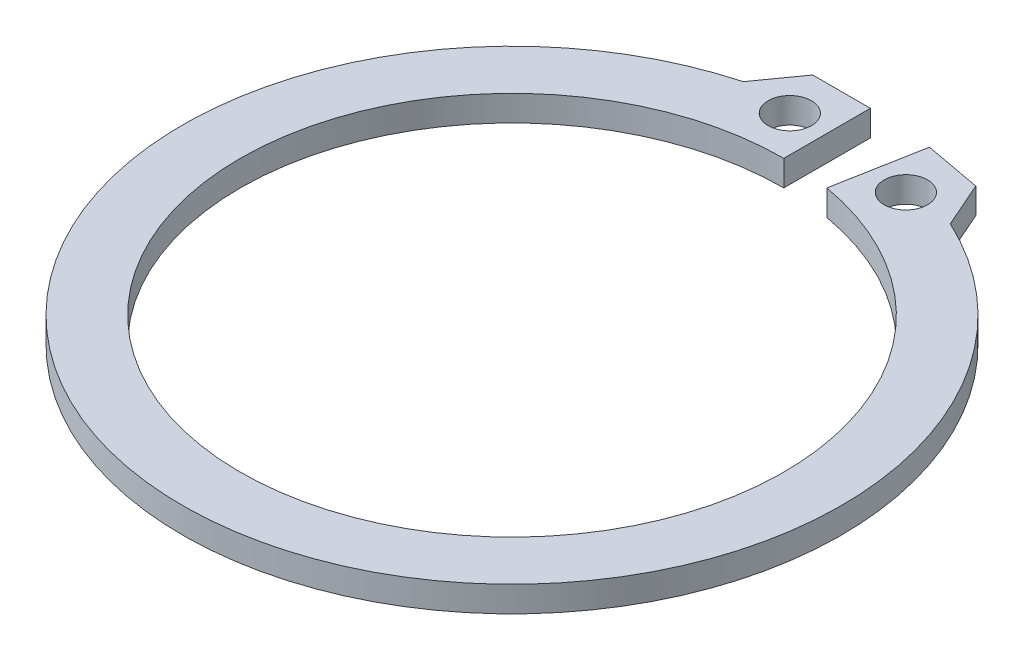
ISO-10303-21;
HEADER;
FILE_DESCRIPTION(('STEP AP214'),'2;1');
FILE_NAME('part.step','',(''),(''),'','','');
FILE_SCHEMA(('AUTOMOTIVE_DESIGN { 1 0 10303 214 1 1 1 1 }'));
ENDSEC;
DATA;
#1=APPLICATION_CONTEXT('core data for automotive mechanical design processes');
#2=APPLICATION_PROTOCOL_DEFINITION('international standard','automotive_design',2000,#1);
#3=PRODUCT_CONTEXT('',#1,'mechanical');
#4=PRODUCT('Part','Part','',(#3));
#5=PRODUCT_RELATED_PRODUCT_CATEGORY('part','',(#4));
#6=PRODUCT_DEFINITION_FORMATION('','',#4);
#7=PRODUCT_DEFINITION_CONTEXT('part definition',#1,'design');
#8=PRODUCT_DEFINITION('design','',#6,#7);
#9=PRODUCT_DEFINITION_SHAPE('','',#8);
#10=(LENGTH_UNIT() NAMED_UNIT(*) SI_UNIT(.MILLI.,.METRE.));
#11=(NAMED_UNIT(*) PLANE_ANGLE_UNIT() SI_UNIT($,.RADIAN.));
#12=(NAMED_UNIT(*) SI_UNIT($,.STERADIAN.) SOLID_ANGLE_UNIT());
#13=UNCERTAINTY_MEASURE_WITH_UNIT(LENGTH_MEASURE(1.E-05),#10,'distance_accuracy_value','');
#14=(GEOMETRIC_REPRESENTATION_CONTEXT(3) GLOBAL_UNCERTAINTY_ASSIGNED_CONTEXT((#13)) GLOBAL_UNIT_ASSIGNED_CONTEXT((#10,
#11,#12)) REPRESENTATION_CONTEXT('',''));
#15=CARTESIAN_POINT('',(0.,0.,0.));
#16=DIRECTION('',(0.,0.,1.));
#17=DIRECTION('',(1.,0.,0.));
#18=AXIS2_PLACEMENT_3D('',#15,#16,#17);
#19=CARTESIAN_POINT('',(0.,0.889,0.));
#20=DIRECTION('',(0.,-1.,0.));
#21=DIRECTION('',(0.,0.,-1.));
#22=AXIS2_PLACEMENT_3D('',#19,#20,#21);
#23=CYLINDRICAL_SURFACE('',#22,9.41448468511322);
#24=CARTESIAN_POINT('',(0.,0.,0.));
#25=DIRECTION('',(0.,-1.,0.));
#26=DIRECTION('',(0.,0.,-1.));
#27=AXIS2_PLACEMENT_3D('',#24,#25,#26);
#28=CIRCLE('',#27,9.41448468511322);
#29=CARTESIAN_POINT('',(1.63480810924314,0.,-9.27145750851419));
#30=VERTEX_POINT('',#29);
#31=CARTESIAN_POINT('',(0.,0.,-9.41448468511322));
#32=VERTEX_POINT('',#31);
#33=EDGE_CURVE('E129',#30,#32,#28,.T.);
#34=ORIENTED_EDGE('',*,*,#33,.T.);
#35=DIRECTION('',(0.,-1.,0.));
#36=VECTOR('',#35,1.);
#37=CARTESIAN_POINT('',(0.,0.889,-9.41448468511322));
#38=LINE('',#37,#36);
#39=CARTESIAN_POINT('',(0.,0.889,-9.41448468511322));
#40=VERTEX_POINT('',#39);
#41=EDGE_CURVE('E11',#40,#32,#38,.T.);
#42=ORIENTED_EDGE('',*,*,#41,.F.);
#43=CARTESIAN_POINT('',(0.,0.889,0.));
#44=DIRECTION('',(0.,-1.,0.));
#45=DIRECTION('',(0.,0.,-1.));
#46=AXIS2_PLACEMENT_3D('',#43,#44,#45);
#47=CIRCLE('',#46,9.41448468511322);
#48=CARTESIAN_POINT('',(1.63480810924314,0.889,-9.27145750851419));
#49=VERTEX_POINT('',#48);
#50=EDGE_CURVE('E144',#49,#40,#47,.T.);
#51=ORIENTED_EDGE('',*,*,#50,.F.);
#52=DIRECTION('',(0.,-1.,0.));
#53=VECTOR('',#52,1.);
#54=CARTESIAN_POINT('',(1.63480810924314,0.889,-9.27145750851419));
#55=LINE('',#54,#53);
#56=EDGE_CURVE('E125',#49,#30,#55,.T.);
#57=ORIENTED_EDGE('',*,*,#56,.T.);
#58=EDGE_LOOP('',(#34,#42,#51,#57));
#59=FACE_BOUND('',#58,.T.);
#60=ADVANCED_FACE('F33',(#59),#23,.F.);
#61=CARTESIAN_POINT('',(0.,0.889,-12.4144846851132));
#62=DIRECTION('',(-1.,0.,0.));
#63=DIRECTION('',(0.,0.,1.));
#64=AXIS2_PLACEMENT_3D('',#61,#62,#63);
#65=PLANE('',#64);
#66=DIRECTION('',(0.,0.,-1.));
#67=VECTOR('',#66,1.);
#68=CARTESIAN_POINT('',(0.,0.,-12.4144846851132));
#69=LINE('',#68,#67);
#70=CARTESIAN_POINT('',(0.,0.,-12.4144846851132));
#71=VERTEX_POINT('',#70);
#72=EDGE_CURVE('E132',#32,#71,#69,.T.);
#73=ORIENTED_EDGE('',*,*,#72,.T.);
#74=DIRECTION('',(0.,-1.,0.));
#75=VECTOR('',#74,1.);
#76=CARTESIAN_POINT('',(0.,0.889,-12.4144846851132));
#77=LINE('',#76,#75);
#78=CARTESIAN_POINT('',(0.,0.889,-12.4144846851132));
#79=VERTEX_POINT('',#78);
#80=EDGE_CURVE('E41',#79,#71,#77,.T.);
#81=ORIENTED_EDGE('',*,*,#80,.F.);
#82=DIRECTION('',(0.,0.,-1.));
#83=VECTOR('',#82,1.);
#84=CARTESIAN_POINT('',(0.,0.889,-12.4144846851132));
#85=LINE('',#84,#83);
#86=EDGE_CURVE('E92',#40,#79,#85,.T.);
#87=ORIENTED_EDGE('',*,*,#86,.F.);
#88=ORIENTED_EDGE('',*,*,#41,.T.);
#89=EDGE_LOOP('',(#73,#81,#87,#88));
#90=FACE_BOUND('',#89,.T.);
#91=ADVANCED_FACE('F213',(#90),#65,.F.);
#92=CARTESIAN_POINT('',(0.,0.889,-12.4144846851132));
#93=DIRECTION('',(0.,0.,1.));
#94=DIRECTION('',(1.,0.,0.));
#95=AXIS2_PLACEMENT_3D('',#92,#93,#94);
#96=PLANE('',#95);
#97=DIRECTION('',(-1.,0.,0.));
#98=VECTOR('',#97,1.);
#99=CARTESIAN_POINT('',(0.,0.,-12.4144846851132));
#100=LINE('',#99,#98);
#101=CARTESIAN_POINT('',(-2.,0.,-12.4144846851132));
#102=VERTEX_POINT('',#101);
#103=EDGE_CURVE('E135',#71,#102,#100,.T.);
#104=ORIENTED_EDGE('',*,*,#103,.T.);
#105=DIRECTION('',(0.,-1.,0.));
#106=VECTOR('',#105,1.);
#107=CARTESIAN_POINT('',(-2.,0.889,-12.4144846851132));
#108=LINE('',#107,#106);
#109=CARTESIAN_POINT('',(-2.,0.889,-12.4144846851132));
#110=VERTEX_POINT('',#109);
#111=EDGE_CURVE('E151',#110,#102,#108,.T.);
#112=ORIENTED_EDGE('',*,*,#111,.F.);
#113=DIRECTION('',(-1.,0.,0.));
#114=VECTOR('',#113,1.);
#115=CARTESIAN_POINT('',(0.,0.889,-12.4144846851132));
#116=LINE('',#115,#114);
#117=EDGE_CURVE('E159',#79,#110,#116,.T.);
#118=ORIENTED_EDGE('',*,*,#117,.F.);
#119=ORIENTED_EDGE('',*,*,#80,.T.);
#120=EDGE_LOOP('',(#104,#112,#118,#119));
#121=FACE_BOUND('',#120,.T.);
#122=ADVANCED_FACE('F157',(#121),#96,.F.);
#123=CARTESIAN_POINT('',(-2.,0.889,-12.4144846851132));
#124=DIRECTION('',(0.813986518689563,0.,0.580883764097126));
#125=DIRECTION('',(0.580883764097126,0.,-0.813986518689563));
#126=AXIS2_PLACEMENT_3D('',#123,#124,#125);
#127=PLANE('',#126);
#128=DIRECTION('',(-0.580883764097126,0.,0.813986518689563));
#129=VECTOR('',#128,1.);
#130=CARTESIAN_POINT('',(-2.,0.,-12.4144846851132));
#131=LINE('',#130,#129);
#132=CARTESIAN_POINT('',(-3.,0.,-11.0131948419468));
#133=VERTEX_POINT('',#132);
#134=EDGE_CURVE('E137',#102,#133,#131,.T.);
#135=ORIENTED_EDGE('',*,*,#134,.T.);
#136=DIRECTION('',(0.,-1.,0.));
#137=VECTOR('',#136,1.);
#138=CARTESIAN_POINT('',(-3.,0.889,-11.0131948419468));
#139=LINE('',#138,#137);
#140=CARTESIAN_POINT('',(-3.,0.889,-11.0131948419468));
#141=VERTEX_POINT('',#140);
#142=EDGE_CURVE('E148',#141,#133,#139,.T.);
#143=ORIENTED_EDGE('',*,*,#142,.F.);
#144=DIRECTION('',(-0.580883764097126,0.,0.813986518689563));
#145=VECTOR('',#144,1.);
#146=CARTESIAN_POINT('',(-2.,0.889,-12.4144846851132));
#147=LINE('',#146,#145);
#148=EDGE_CURVE('E171',#110,#141,#147,.T.);
#149=ORIENTED_EDGE('',*,*,#148,.F.);
#150=ORIENTED_EDGE('',*,*,#111,.T.);
#151=EDGE_LOOP('',(#135,#143,#149,#150));
#152=FACE_BOUND('',#151,.T.);
#153=ADVANCED_FACE('F167',(#152),#127,.F.);
#154=CARTESIAN_POINT('',(0.,0.889,0.));
#155=DIRECTION('',(0.,-1.,0.));
#156=DIRECTION('',(0.,0.,-1.));
#157=AXIS2_PLACEMENT_3D('',#154,#155,#156);
#158=CYLINDRICAL_SURFACE('',#157,11.4144846851132);
#159=CARTESIAN_POINT('',(0.,0.,0.));
#160=DIRECTION('',(0.,1.,0.));
#161=DIRECTION('',(0.,0.,-1.));
#162=AXIS2_PLACEMENT_3D('',#159,#160,#161);
#163=CIRCLE('',#162,11.4144846851132);
#164=CARTESIAN_POINT('',(4.84891471824417,0.,-10.3333676350878));
#165=VERTEX_POINT('',#164);
#166=EDGE_CURVE('E139',#133,#165,#163,.T.);
#167=ORIENTED_EDGE('',*,*,#166,.T.);
#168=DIRECTION('',(0.,-1.,0.));
#169=VECTOR('',#168,1.);
#170=CARTESIAN_POINT('',(4.84891471824417,0.889,-10.3333676350878));
#171=LINE('',#170,#169);
#172=CARTESIAN_POINT('',(4.84891471824417,0.889,-10.3333676350878));
#173=VERTEX_POINT('',#172);
#174=EDGE_CURVE('E120',#173,#165,#171,.T.);
#175=ORIENTED_EDGE('',*,*,#174,.F.);
#176=CARTESIAN_POINT('',(0.,0.889,0.));
#177=DIRECTION('',(0.,1.,0.));
#178=DIRECTION('',(0.,0.,-1.));
#179=AXIS2_PLACEMENT_3D('',#176,#177,#178);
#180=CIRCLE('',#179,11.4144846851132);
#181=EDGE_CURVE('E111',#141,#173,#180,.T.);
#182=ORIENTED_EDGE('',*,*,#181,.F.);
#183=ORIENTED_EDGE('',*,*,#142,.T.);
#184=EDGE_LOOP('',(#167,#175,#182,#183));
#185=FACE_BOUND('',#184,.T.);
#186=ADVANCED_FACE('F170',(#185),#158,.T.);
#187=CARTESIAN_POINT('',(4.15573147773122,0.889,-11.9081379130976));
#188=DIRECTION('',(-0.915254107129877,0.,0.402877052438943));
#189=DIRECTION('',(0.402877052438943,0.,0.915254107129877));
#190=AXIS2_PLACEMENT_3D('',#187,#188,#189);
#191=PLANE('',#190);
#192=DIRECTION('',(-0.402877052438943,0.,-0.915254107129877));
#193=VECTOR('',#192,1.);
#194=CARTESIAN_POINT('',(4.15573147773122,0.,-11.9081379130976));
#195=LINE('',#194,#193);
#196=CARTESIAN_POINT('',(4.15573147773122,0.,-11.9081379130976));
#197=VERTEX_POINT('',#196);
#198=EDGE_CURVE('E119',#165,#197,#195,.T.);
#199=ORIENTED_EDGE('',*,*,#198,.T.);
#200=DIRECTION('',(0.,-1.,0.));
#201=VECTOR('',#200,1.);
#202=CARTESIAN_POINT('',(4.15573147773122,0.889,-11.9081379130976));
#203=LINE('',#202,#201);
#204=CARTESIAN_POINT('',(4.15573147773122,0.889,-11.9081379130976));
#205=VERTEX_POINT('',#204);
#206=EDGE_CURVE('E116',#205,#197,#203,.T.);
#207=ORIENTED_EDGE('',*,*,#206,.F.);
#208=DIRECTION('',(-0.402877052438943,0.,-0.915254107129877));
#209=VECTOR('',#208,1.);
#210=CARTESIAN_POINT('',(4.15573147773122,0.889,-11.9081379130976));
#211=LINE('',#210,#209);
#212=EDGE_CURVE('E105',#173,#205,#211,.T.);
#213=ORIENTED_EDGE('',*,*,#212,.F.);
#214=ORIENTED_EDGE('',*,*,#174,.T.);
#215=EDGE_LOOP('',(#199,#207,#213,#214));
#216=FACE_BOUND('',#215,.T.);
#217=ADVANCED_FACE('F117',(#216),#191,.F.);
#218=CARTESIAN_POINT('',(2.18900860157751,0.889,-12.2714575085142));
#219=DIRECTION('',(-0.181659797708278,0.,0.983361438076859));
#220=DIRECTION('',(0.983361438076859,0.,0.181659797708278));
#221=AXIS2_PLACEMENT_3D('',#218,#219,#220);
#222=PLANE('',#221);
#223=DIRECTION('',(-0.983361438076859,0.,-0.181659797708278));
#224=VECTOR('',#223,1.);
#225=CARTESIAN_POINT('',(2.18900860157751,0.,-12.2714575085142));
#226=LINE('',#225,#224);
#227=CARTESIAN_POINT('',(2.18900860157751,0.,-12.2714575085142));
#228=VERTEX_POINT('',#227);
#229=EDGE_CURVE('E78',#197,#228,#226,.T.);
#230=ORIENTED_EDGE('',*,*,#229,.T.);
#231=DIRECTION('',(0.,-1.,0.));
#232=VECTOR('',#231,1.);
#233=CARTESIAN_POINT('',(2.18900860157751,0.889,-12.2714575085142));
#234=LINE('',#233,#232);
#235=CARTESIAN_POINT('',(2.18900860157751,0.889,-12.2714575085142));
#236=VERTEX_POINT('',#235);
#237=EDGE_CURVE('E121',#236,#228,#234,.T.);
#238=ORIENTED_EDGE('',*,*,#237,.F.);
#239=DIRECTION('',(-0.983361438076859,0.,-0.181659797708278));
#240=VECTOR('',#239,1.);
#241=CARTESIAN_POINT('',(2.18900860157751,0.889,-12.2714575085142));
#242=LINE('',#241,#240);
#243=EDGE_CURVE('E109',#205,#236,#242,.T.);
#244=ORIENTED_EDGE('',*,*,#243,.F.);
#245=ORIENTED_EDGE('',*,*,#206,.T.);
#246=EDGE_LOOP('',(#230,#238,#244,#245));
#247=FACE_BOUND('',#246,.T.);
#248=ADVANCED_FACE('F123',(#247),#222,.F.);
#249=CARTESIAN_POINT('',(1.63480810924314,0.889,-9.27145750851419));
#250=DIRECTION('',(0.983361438076859,0.,0.181659797708274));
#251=DIRECTION('',(0.181659797708274,0.,-0.983361438076859));
#252=AXIS2_PLACEMENT_3D('',#249,#250,#251);
#253=PLANE('',#252);
#254=DIRECTION('',(-0.181659797708274,0.,0.98336143807686));
#255=VECTOR('',#254,1.);
#256=CARTESIAN_POINT('',(1.63480810924314,0.,-9.27145750851419));
#257=LINE('',#256,#255);
#258=EDGE_CURVE('E84',#228,#30,#257,.T.);
#259=ORIENTED_EDGE('',*,*,#258,.T.);
#260=ORIENTED_EDGE('',*,*,#56,.F.);
#261=DIRECTION('',(-0.181659797708274,0.,0.98336143807686));
#262=VECTOR('',#261,1.);
#263=CARTESIAN_POINT('',(1.63480810924314,0.889,-9.27145750851419));
#264=LINE('',#263,#262);
#265=EDGE_CURVE('E49',#236,#49,#264,.T.);
#266=ORIENTED_EDGE('',*,*,#265,.F.);
#267=ORIENTED_EDGE('',*,*,#237,.T.);
#268=EDGE_LOOP('',(#259,#260,#266,#267));
#269=FACE_BOUND('',#268,.T.);
#270=ADVANCED_FACE('F200',(#269),#253,.F.);
#271=CARTESIAN_POINT('',(0.,0.889,0.));
#272=DIRECTION('',(0.,-1.,0.));
#273=DIRECTION('',(0.,0.,-1.));
#274=AXIS2_PLACEMENT_3D('',#271,#272,#273);
#275=PLANE('',#274);
#276=CARTESIAN_POINT('',(3.13447106131304,0.889,-10.5084440075243));
#277=DIRECTION('',(0.,1.,0.));
#278=DIRECTION('',(0.,0.,1.));
#279=AXIS2_PLACEMENT_3D('',#276,#277,#278);
#280=CIRCLE('',#279,0.75);
#281=CARTESIAN_POINT('',(3.13447106131304,0.889,-9.75844400752434));
#282=VERTEX_POINT('',#281);
#283=EDGE_CURVE('E183',#282,#282,#280,.T.);
#284=ORIENTED_EDGE('',*,*,#283,.F.);
#285=EDGE_LOOP('',(#284));
#286=FACE_BOUND('',#285,.T.);
#287=CARTESIAN_POINT('',(-1.25,0.889,-10.8728082751695));
#288=DIRECTION('',(0.,1.,0.));
#289=DIRECTION('',(0.,0.,1.));
#290=AXIS2_PLACEMENT_3D('',#287,#288,#289);
#291=CIRCLE('',#290,0.750000000000028);
#292=CARTESIAN_POINT('',(-1.25,0.889,-10.1228082751695));
#293=VERTEX_POINT('',#292);
#294=EDGE_CURVE('E177',#293,#293,#291,.T.);
#295=ORIENTED_EDGE('',*,*,#294,.F.);
#296=EDGE_LOOP('',(#295));
#297=FACE_BOUND('',#296,.T.);
#298=ORIENTED_EDGE('',*,*,#50,.T.);
#299=ORIENTED_EDGE('',*,*,#86,.T.);
#300=ORIENTED_EDGE('',*,*,#117,.T.);
#301=ORIENTED_EDGE('',*,*,#148,.T.);
#302=ORIENTED_EDGE('',*,*,#181,.T.);
#303=ORIENTED_EDGE('',*,*,#212,.T.);
#304=ORIENTED_EDGE('',*,*,#243,.T.);
#305=ORIENTED_EDGE('',*,*,#265,.T.);
#306=EDGE_LOOP('',(#298,#299,#300,#301,#302,#303,#304,#305));
#307=FACE_BOUND('',#306,.T.);
#308=ADVANCED_FACE('F107',(#286,#297,#307),#275,.F.);
#309=CARTESIAN_POINT('',(0.,0.,0.));
#310=DIRECTION('',(0.,-1.,0.));
#311=DIRECTION('',(0.,0.,-1.));
#312=AXIS2_PLACEMENT_3D('',#309,#310,#311);
#313=PLANE('',#312);
#314=CARTESIAN_POINT('',(3.13447106131304,0.,-10.5084440075243));
#315=DIRECTION('',(0.,1.,0.));
#316=DIRECTION('',(0.,0.,1.));
#317=AXIS2_PLACEMENT_3D('',#314,#315,#316);
#318=CIRCLE('',#317,0.75);
#319=CARTESIAN_POINT('',(3.13447106131304,0.,-9.75844400752434));
#320=VERTEX_POINT('',#319);
#321=EDGE_CURVE('E180',#320,#320,#318,.T.);
#322=ORIENTED_EDGE('',*,*,#321,.T.);
#323=EDGE_LOOP('',(#322));
#324=FACE_BOUND('',#323,.T.);
#325=CARTESIAN_POINT('',(-1.25,0.,-10.8728082751695));
#326=DIRECTION('',(0.,1.,0.));
#327=DIRECTION('',(0.,0.,1.));
#328=AXIS2_PLACEMENT_3D('',#325,#326,#327);
#329=CIRCLE('',#328,0.750000000000028);
#330=CARTESIAN_POINT('',(-1.25,0.,-10.1228082751695));
#331=VERTEX_POINT('',#330);
#332=EDGE_CURVE('E133',#331,#331,#329,.T.);
#333=ORIENTED_EDGE('',*,*,#332,.T.);
#334=EDGE_LOOP('',(#333));
#335=FACE_BOUND('',#334,.T.);
#336=ORIENTED_EDGE('',*,*,#33,.F.);
#337=ORIENTED_EDGE('',*,*,#258,.F.);
#338=ORIENTED_EDGE('',*,*,#229,.F.);
#339=ORIENTED_EDGE('',*,*,#198,.F.);
#340=ORIENTED_EDGE('',*,*,#166,.F.);
#341=ORIENTED_EDGE('',*,*,#134,.F.);
#342=ORIENTED_EDGE('',*,*,#103,.F.);
#343=ORIENTED_EDGE('',*,*,#72,.F.);
#344=EDGE_LOOP('',(#336,#337,#338,#339,#340,#341,#342,#343));
#345=FACE_BOUND('',#344,.T.);
#346=ADVANCED_FACE('F163',(#324,#335,#345),#313,.T.);
#347=CARTESIAN_POINT('',(-1.25,0.,-10.8728082751695));
#348=DIRECTION('',(0.,1.,0.));
#349=DIRECTION('',(0.,0.,1.));
#350=AXIS2_PLACEMENT_3D('',#347,#348,#349);
#351=CYLINDRICAL_SURFACE('',#350,0.750000000000028);
#352=ORIENTED_EDGE('',*,*,#332,.F.);
#353=EDGE_LOOP('',(#352));
#354=FACE_BOUND('',#353,.T.);
#355=ORIENTED_EDGE('',*,*,#294,.T.);
#356=EDGE_LOOP('',(#355));
#357=FACE_BOUND('',#356,.T.);
#358=ADVANCED_FACE('F194',(#354,#357),#351,.F.);
#359=CARTESIAN_POINT('',(3.13447106131304,0.,-10.5084440075243));
#360=DIRECTION('',(0.,1.,0.));
#361=DIRECTION('',(0.,0.,1.));
#362=AXIS2_PLACEMENT_3D('',#359,#360,#361);
#363=CYLINDRICAL_SURFACE('',#362,0.75);
#364=ORIENTED_EDGE('',*,*,#321,.F.);
#365=EDGE_LOOP('',(#364));
#366=FACE_BOUND('',#365,.T.);
#367=ORIENTED_EDGE('',*,*,#283,.T.);
#368=EDGE_LOOP('',(#367));
#369=FACE_BOUND('',#368,.T.);
#370=ADVANCED_FACE('F191',(#366,#369),#363,.F.);
#371=CLOSED_SHELL('',(#60,#91,#122,#153,#186,#217,#248,#270,#308,#346,#358,#370));
#372=MANIFOLD_SOLID_BREP('B2',#371);
#373=ADVANCED_BREP_SHAPE_REPRESENTATION('',(#18,#372),#14);
#374=SHAPE_DEFINITION_REPRESENTATION(#9,#373);
ENDSEC;
END-ISO-10303-21;
